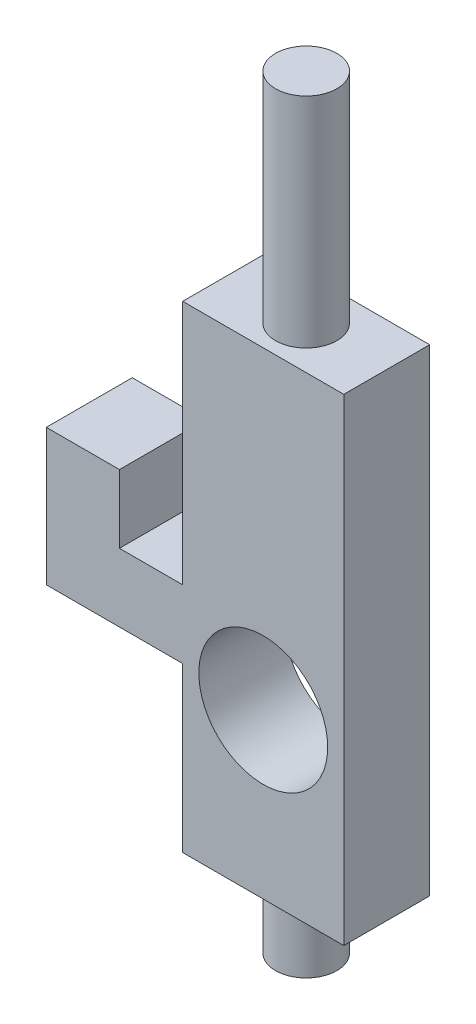
ISO-10303-21;
HEADER;
FILE_DESCRIPTION(('STEP AP214'),'2;1');
FILE_NAME('part.step','',(''),(''),'','','');
FILE_SCHEMA(('AUTOMOTIVE_DESIGN { 1 0 10303 214 1 1 1 1 }'));
ENDSEC;
DATA;
#1=APPLICATION_CONTEXT('core data for automotive mechanical design processes');
#2=APPLICATION_PROTOCOL_DEFINITION('international standard','automotive_design',2000,#1);
#3=PRODUCT_CONTEXT('',#1,'mechanical');
#4=PRODUCT('Part','Part','',(#3));
#5=PRODUCT_RELATED_PRODUCT_CATEGORY('part','',(#4));
#6=PRODUCT_DEFINITION_FORMATION('','',#4);
#7=PRODUCT_DEFINITION_CONTEXT('part definition',#1,'design');
#8=PRODUCT_DEFINITION('design','',#6,#7);
#9=PRODUCT_DEFINITION_SHAPE('','',#8);
#10=(LENGTH_UNIT() NAMED_UNIT(*) SI_UNIT(.MILLI.,.METRE.));
#11=(NAMED_UNIT(*) PLANE_ANGLE_UNIT() SI_UNIT($,.RADIAN.));
#12=(NAMED_UNIT(*) SI_UNIT($,.STERADIAN.) SOLID_ANGLE_UNIT());
#13=UNCERTAINTY_MEASURE_WITH_UNIT(LENGTH_MEASURE(1.E-05),#10,'distance_accuracy_value','');
#14=(GEOMETRIC_REPRESENTATION_CONTEXT(3) GLOBAL_UNCERTAINTY_ASSIGNED_CONTEXT((#13)) GLOBAL_UNIT_ASSIGNED_CONTEXT((#10,
#11,#12)) REPRESENTATION_CONTEXT('',''));
#15=CARTESIAN_POINT('',(0.,0.,0.));
#16=DIRECTION('',(0.,0.,1.));
#17=DIRECTION('',(1.,0.,0.));
#18=AXIS2_PLACEMENT_3D('',#15,#16,#17);
#19=CARTESIAN_POINT('',(-20.2,27.94,-3.99999999999999));
#20=DIRECTION('',(0.,-1.,0.));
#21=DIRECTION('',(0.,0.,-1.));
#22=AXIS2_PLACEMENT_3D('',#19,#20,#21);
#23=PLANE('',#22);
#24=DIRECTION('',(0.,0.,-1.));
#25=VECTOR('',#24,1.);
#26=CARTESIAN_POINT('',(-13.3876706043336,27.94,3.99999999999999));
#27=LINE('',#26,#25);
#28=CARTESIAN_POINT('',(-13.3876706043336,27.94,3.99999999999999));
#29=VERTEX_POINT('',#28);
#30=CARTESIAN_POINT('',(-13.3876706043336,27.94,-3.99999999999999));
#31=VERTEX_POINT('',#30);
#32=EDGE_CURVE('E135',#29,#31,#27,.T.);
#33=ORIENTED_EDGE('',*,*,#32,.F.);
#34=DIRECTION('',(1.,0.,0.));
#35=VECTOR('',#34,1.);
#36=CARTESIAN_POINT('',(-20.2,27.94,4.));
#37=LINE('',#36,#35);
#38=CARTESIAN_POINT('',(-7.5,27.94,4.));
#39=VERTEX_POINT('',#38);
#40=EDGE_CURVE('E158',#29,#39,#37,.T.);
#41=ORIENTED_EDGE('',*,*,#40,.T.);
#42=DIRECTION('',(0.,0.,-1.));
#43=VECTOR('',#42,1.);
#44=CARTESIAN_POINT('',(-7.5,27.94,-4.));
#45=LINE('',#44,#43);
#46=CARTESIAN_POINT('',(-7.5,27.94,-4.));
#47=VERTEX_POINT('',#46);
#48=EDGE_CURVE('E144',#39,#47,#45,.T.);
#49=ORIENTED_EDGE('',*,*,#48,.T.);
#50=DIRECTION('',(1.,0.,0.));
#51=VECTOR('',#50,1.);
#52=CARTESIAN_POINT('',(-20.2,27.94,-3.99999999999999));
#53=LINE('',#52,#51);
#54=EDGE_CURVE('E156',#31,#47,#53,.T.);
#55=ORIENTED_EDGE('',*,*,#54,.F.);
#56=EDGE_LOOP('',(#33,#41,#49,#55));
#57=FACE_BOUND('',#56,.T.);
#58=ADVANCED_FACE('F33',(#57),#23,.F.);
#59=CARTESIAN_POINT('',(-7.5,50.8,-4.));
#60=DIRECTION('',(1.,0.,0.));
#61=DIRECTION('',(0.,0.,-1.));
#62=AXIS2_PLACEMENT_3D('',#59,#60,#61);
#63=PLANE('',#62);
#64=DIRECTION('',(0.,0.,1.));
#65=VECTOR('',#64,1.);
#66=CARTESIAN_POINT('',(-7.5,21.59,-4.));
#67=LINE('',#66,#65);
#68=CARTESIAN_POINT('',(-7.5,21.59,-4.));
#69=VERTEX_POINT('',#68);
#70=CARTESIAN_POINT('',(-7.5,21.59,4.));
#71=VERTEX_POINT('',#70);
#72=EDGE_CURVE('E50',#69,#71,#67,.T.);
#73=ORIENTED_EDGE('',*,*,#72,.F.);
#74=DIRECTION('',(0.,-1.,0.));
#75=VECTOR('',#74,1.);
#76=CARTESIAN_POINT('',(-7.5,50.8,-4.));
#77=LINE('',#76,#75);
#78=CARTESIAN_POINT('',(-7.5,6.35,-4.));
#79=VERTEX_POINT('',#78);
#80=EDGE_CURVE('E194',#69,#79,#77,.T.);
#81=ORIENTED_EDGE('',*,*,#80,.T.);
#82=DIRECTION('',(0.,0.,1.));
#83=VECTOR('',#82,1.);
#84=CARTESIAN_POINT('',(-7.5,6.35,-4.));
#85=LINE('',#84,#83);
#86=CARTESIAN_POINT('',(-7.5,6.35,4.));
#87=VERTEX_POINT('',#86);
#88=EDGE_CURVE('E186',#79,#87,#85,.T.);
#89=ORIENTED_EDGE('',*,*,#88,.T.);
#90=DIRECTION('',(0.,-1.,0.));
#91=VECTOR('',#90,1.);
#92=CARTESIAN_POINT('',(-7.5,50.8,4.));
#93=LINE('',#92,#91);
#94=EDGE_CURVE('E55',#71,#87,#93,.T.);
#95=ORIENTED_EDGE('',*,*,#94,.F.);
#96=EDGE_LOOP('',(#73,#81,#89,#95));
#97=FACE_BOUND('',#96,.T.);
#98=ADVANCED_FACE('F220',(#97),#63,.F.);
#99=ORIENTED_EDGE('',*,*,#48,.F.);
#100=CARTESIAN_POINT('',(-7.5,50.8,4.));
#101=VERTEX_POINT('',#100);
#102=EDGE_CURVE('E191',#101,#39,#93,.T.);
#103=ORIENTED_EDGE('',*,*,#102,.F.);
#104=DIRECTION('',(0.,0.,1.));
#105=VECTOR('',#104,1.);
#106=CARTESIAN_POINT('',(-7.5,50.8,-4.));
#107=LINE('',#106,#105);
#108=CARTESIAN_POINT('',(-7.5,50.8,-4.));
#109=VERTEX_POINT('',#108);
#110=EDGE_CURVE('E176',#109,#101,#107,.T.);
#111=ORIENTED_EDGE('',*,*,#110,.F.);
#112=EDGE_CURVE('E195',#109,#47,#77,.T.);
#113=ORIENTED_EDGE('',*,*,#112,.T.);
#114=EDGE_LOOP('',(#99,#103,#111,#113));
#115=FACE_BOUND('',#114,.T.);
#116=ADVANCED_FACE('F217',(#115),#63,.F.);
#117=CARTESIAN_POINT('',(0.,6.35,0.));
#118=DIRECTION('',(0.,-1.,0.));
#119=DIRECTION('',(0.,0.,-1.));
#120=AXIS2_PLACEMENT_3D('',#117,#118,#119);
#121=CYLINDRICAL_SURFACE('',#120,2.855);
#122=CARTESIAN_POINT('',(0.,6.35,0.));
#123=DIRECTION('',(0.,1.,0.));
#124=DIRECTION('',(0.,0.,1.));
#125=AXIS2_PLACEMENT_3D('',#122,#123,#124);
#126=CIRCLE('',#125,2.855);
#127=CARTESIAN_POINT('',(0.,6.35,2.855));
#128=VERTEX_POINT('',#127);
#129=EDGE_CURVE('E42',#128,#128,#126,.T.);
#130=ORIENTED_EDGE('',*,*,#129,.F.);
#131=EDGE_LOOP('',(#130));
#132=FACE_BOUND('',#131,.T.);
#133=CARTESIAN_POINT('',(0.,0.,0.));
#134=DIRECTION('',(0.,1.,0.));
#135=DIRECTION('',(0.,0.,1.));
#136=AXIS2_PLACEMENT_3D('',#133,#134,#135);
#137=CIRCLE('',#136,2.855);
#138=CARTESIAN_POINT('',(0.,0.,2.855));
#139=VERTEX_POINT('',#138);
#140=EDGE_CURVE('E37',#139,#139,#137,.T.);
#141=ORIENTED_EDGE('',*,*,#140,.T.);
#142=EDGE_LOOP('',(#141));
#143=FACE_BOUND('',#142,.T.);
#144=ADVANCED_FACE('F35',(#132,#143),#121,.T.);
#145=CARTESIAN_POINT('',(0.,0.,0.));
#146=DIRECTION('',(0.,1.,0.));
#147=DIRECTION('',(0.,0.,1.));
#148=AXIS2_PLACEMENT_3D('',#145,#146,#147);
#149=PLANE('',#148);
#150=ORIENTED_EDGE('',*,*,#140,.F.);
#151=EDGE_LOOP('',(#150));
#152=FACE_BOUND('',#151,.T.);
#153=ADVANCED_FACE('F207',(#152),#149,.F.);
#154=CARTESIAN_POINT('',(7.5,50.8,-4.));
#155=DIRECTION('',(-1.,0.,0.));
#156=DIRECTION('',(0.,0.,1.));
#157=AXIS2_PLACEMENT_3D('',#154,#155,#156);
#158=PLANE('',#157);
#159=DIRECTION('',(0.,0.,-1.));
#160=VECTOR('',#159,1.);
#161=CARTESIAN_POINT('',(7.5,6.35,-4.));
#162=LINE('',#161,#160);
#163=CARTESIAN_POINT('',(7.5,6.35,4.));
#164=VERTEX_POINT('',#163);
#165=CARTESIAN_POINT('',(7.5,6.35,-4.));
#166=VERTEX_POINT('',#165);
#167=EDGE_CURVE('E169',#164,#166,#162,.T.);
#168=ORIENTED_EDGE('',*,*,#167,.T.);
#169=DIRECTION('',(0.,-1.,0.));
#170=VECTOR('',#169,1.);
#171=CARTESIAN_POINT('',(7.5,50.8,-4.));
#172=LINE('',#171,#170);
#173=CARTESIAN_POINT('',(7.5,50.8,-4.));
#174=VERTEX_POINT('',#173);
#175=EDGE_CURVE('E198',#174,#166,#172,.T.);
#176=ORIENTED_EDGE('',*,*,#175,.F.);
#177=DIRECTION('',(0.,0.,-1.));
#178=VECTOR('',#177,1.);
#179=CARTESIAN_POINT('',(7.5,50.8,-4.));
#180=LINE('',#179,#178);
#181=CARTESIAN_POINT('',(7.5,50.8,4.));
#182=VERTEX_POINT('',#181);
#183=EDGE_CURVE('E170',#182,#174,#180,.T.);
#184=ORIENTED_EDGE('',*,*,#183,.F.);
#185=DIRECTION('',(0.,-1.,0.));
#186=VECTOR('',#185,1.);
#187=CARTESIAN_POINT('',(7.5,50.8,4.));
#188=LINE('',#187,#186);
#189=EDGE_CURVE('E180',#182,#164,#188,.T.);
#190=ORIENTED_EDGE('',*,*,#189,.T.);
#191=EDGE_LOOP('',(#168,#176,#184,#190));
#192=FACE_BOUND('',#191,.T.);
#193=ADVANCED_FACE('F209',(#192),#158,.F.);
#194=CARTESIAN_POINT('',(-7.5,50.8,-4.));
#195=DIRECTION('',(0.,0.,1.));
#196=DIRECTION('',(1.,0.,0.));
#197=AXIS2_PLACEMENT_3D('',#194,#195,#196);
#198=PLANE('',#197);
#199=CARTESIAN_POINT('',(0.,21.59,-4.));
#200=DIRECTION('',(0.,0.,1.));
#201=DIRECTION('',(1.,0.,0.));
#202=AXIS2_PLACEMENT_3D('',#199,#200,#201);
#203=CIRCLE('',#202,6.);
#204=CARTESIAN_POINT('',(6.,21.59,-4.));
#205=VERTEX_POINT('',#204);
#206=EDGE_CURVE('E166',#205,#205,#203,.T.);
#207=ORIENTED_EDGE('',*,*,#206,.T.);
#208=EDGE_LOOP('',(#207));
#209=FACE_BOUND('',#208,.T.);
#210=DIRECTION('',(-1.,0.,0.));
#211=VECTOR('',#210,1.);
#212=CARTESIAN_POINT('',(-7.5,6.35,-4.));
#213=LINE('',#212,#211);
#214=EDGE_CURVE('E183',#166,#79,#213,.T.);
#215=ORIENTED_EDGE('',*,*,#214,.T.);
#216=ORIENTED_EDGE('',*,*,#80,.F.);
#217=DIRECTION('',(1.,0.,0.));
#218=VECTOR('',#217,1.);
#219=CARTESIAN_POINT('',(-20.2,21.59,-3.99999999999999));
#220=LINE('',#219,#218);
#221=CARTESIAN_POINT('',(-20.2,21.59,-3.99999999999999));
#222=VERTEX_POINT('',#221);
#223=EDGE_CURVE('E153',#222,#69,#220,.T.);
#224=ORIENTED_EDGE('',*,*,#223,.F.);
#225=DIRECTION('',(0.,-1.,0.));
#226=VECTOR('',#225,1.);
#227=CARTESIAN_POINT('',(-20.2,21.59,-3.99999999999999));
#228=LINE('',#227,#226);
#229=CARTESIAN_POINT('',(-20.2,34.29,-3.99999999999999));
#230=VERTEX_POINT('',#229);
#231=EDGE_CURVE('E120',#230,#222,#228,.T.);
#232=ORIENTED_EDGE('',*,*,#231,.F.);
#233=DIRECTION('',(-1.,0.,0.));
#234=VECTOR('',#233,1.);
#235=CARTESIAN_POINT('',(-13.3876706043336,34.29,-3.99999999999999));
#236=LINE('',#235,#234);
#237=CARTESIAN_POINT('',(-13.3876706043336,34.29,-3.99999999999999));
#238=VERTEX_POINT('',#237);
#239=EDGE_CURVE('E134',#238,#230,#236,.T.);
#240=ORIENTED_EDGE('',*,*,#239,.F.);
#241=DIRECTION('',(0.,-1.,0.));
#242=VECTOR('',#241,1.);
#243=CARTESIAN_POINT('',(-13.3876706043336,34.29,-3.99999999999999));
#244=LINE('',#243,#242);
#245=EDGE_CURVE('E140',#238,#31,#244,.T.);
#246=ORIENTED_EDGE('',*,*,#245,.T.);
#247=ORIENTED_EDGE('',*,*,#54,.T.);
#248=ORIENTED_EDGE('',*,*,#112,.F.);
#249=DIRECTION('',(-1.,0.,0.));
#250=VECTOR('',#249,1.);
#251=CARTESIAN_POINT('',(-7.5,50.8,-4.));
#252=LINE('',#251,#250);
#253=EDGE_CURVE('E173',#174,#109,#252,.T.);
#254=ORIENTED_EDGE('',*,*,#253,.F.);
#255=ORIENTED_EDGE('',*,*,#175,.T.);
#256=EDGE_LOOP('',(#215,#216,#224,#232,#240,#246,#247,#248,#254,#255));
#257=FACE_BOUND('',#256,.T.);
#258=ADVANCED_FACE('F214',(#209,#257),#198,.F.);
#259=CARTESIAN_POINT('',(-7.5,50.8,4.));
#260=DIRECTION('',(0.,0.,-1.));
#261=DIRECTION('',(-1.,0.,0.));
#262=AXIS2_PLACEMENT_3D('',#259,#260,#261);
#263=PLANE('',#262);
#264=CARTESIAN_POINT('',(0.,21.59,4.));
#265=DIRECTION('',(0.,0.,1.));
#266=DIRECTION('',(1.,0.,0.));
#267=AXIS2_PLACEMENT_3D('',#264,#265,#266);
#268=CIRCLE('',#267,6.);
#269=CARTESIAN_POINT('',(6.,21.59,4.));
#270=VERTEX_POINT('',#269);
#271=EDGE_CURVE('E162',#270,#270,#268,.T.);
#272=ORIENTED_EDGE('',*,*,#271,.F.);
#273=EDGE_LOOP('',(#272));
#274=FACE_BOUND('',#273,.T.);
#275=DIRECTION('',(1.,0.,0.));
#276=VECTOR('',#275,1.);
#277=CARTESIAN_POINT('',(-7.5,6.35,4.));
#278=LINE('',#277,#276);
#279=EDGE_CURVE('E174',#87,#164,#278,.T.);
#280=ORIENTED_EDGE('',*,*,#279,.T.);
#281=ORIENTED_EDGE('',*,*,#189,.F.);
#282=DIRECTION('',(1.,0.,0.));
#283=VECTOR('',#282,1.);
#284=CARTESIAN_POINT('',(-7.5,50.8,4.));
#285=LINE('',#284,#283);
#286=EDGE_CURVE('E178',#101,#182,#285,.T.);
#287=ORIENTED_EDGE('',*,*,#286,.F.);
#288=ORIENTED_EDGE('',*,*,#102,.T.);
#289=ORIENTED_EDGE('',*,*,#40,.F.);
#290=DIRECTION('',(0.,-1.,0.));
#291=VECTOR('',#290,1.);
#292=CARTESIAN_POINT('',(-13.3876706043336,34.29,3.99999999999999));
#293=LINE('',#292,#291);
#294=CARTESIAN_POINT('',(-13.3876706043336,34.29,3.99999999999999));
#295=VERTEX_POINT('',#294);
#296=EDGE_CURVE('E126',#295,#29,#293,.T.);
#297=ORIENTED_EDGE('',*,*,#296,.F.);
#298=DIRECTION('',(1.,0.,0.));
#299=VECTOR('',#298,1.);
#300=CARTESIAN_POINT('',(-13.3876706043336,34.29,3.99999999999999));
#301=LINE('',#300,#299);
#302=CARTESIAN_POINT('',(-20.2,34.29,3.99999999999999));
#303=VERTEX_POINT('',#302);
#304=EDGE_CURVE('E123',#303,#295,#301,.T.);
#305=ORIENTED_EDGE('',*,*,#304,.F.);
#306=DIRECTION('',(0.,1.,0.));
#307=VECTOR('',#306,1.);
#308=CARTESIAN_POINT('',(-20.2,21.59,4.));
#309=LINE('',#308,#307);
#310=CARTESIAN_POINT('',(-20.2,21.59,4.));
#311=VERTEX_POINT('',#310);
#312=EDGE_CURVE('E110',#311,#303,#309,.T.);
#313=ORIENTED_EDGE('',*,*,#312,.F.);
#314=DIRECTION('',(1.,0.,0.));
#315=VECTOR('',#314,1.);
#316=CARTESIAN_POINT('',(-20.2,21.59,4.));
#317=LINE('',#316,#315);
#318=EDGE_CURVE('E148',#311,#71,#317,.T.);
#319=ORIENTED_EDGE('',*,*,#318,.T.);
#320=ORIENTED_EDGE('',*,*,#94,.T.);
#321=EDGE_LOOP('',(#280,#281,#287,#288,#289,#297,#305,#313,#319,#320));
#322=FACE_BOUND('',#321,.T.);
#323=ADVANCED_FACE('F124',(#274,#322),#263,.F.);
#324=CARTESIAN_POINT('',(0.,50.8,0.));
#325=DIRECTION('',(0.,1.,0.));
#326=DIRECTION('',(0.,0.,1.));
#327=AXIS2_PLACEMENT_3D('',#324,#325,#326);
#328=PLANE('',#327);
#329=CARTESIAN_POINT('',(0.,50.8,0.));
#330=DIRECTION('',(0.,1.,0.));
#331=DIRECTION('',(0.,0.,1.));
#332=AXIS2_PLACEMENT_3D('',#329,#330,#331);
#333=CIRCLE('',#332,2.855);
#334=CARTESIAN_POINT('',(0.,50.8,2.855));
#335=VERTEX_POINT('',#334);
#336=EDGE_CURVE('E11',#335,#335,#333,.T.);
#337=ORIENTED_EDGE('',*,*,#336,.F.);
#338=EDGE_LOOP('',(#337));
#339=FACE_BOUND('',#338,.T.);
#340=ORIENTED_EDGE('',*,*,#183,.T.);
#341=ORIENTED_EDGE('',*,*,#253,.T.);
#342=ORIENTED_EDGE('',*,*,#110,.T.);
#343=ORIENTED_EDGE('',*,*,#286,.T.);
#344=EDGE_LOOP('',(#340,#341,#342,#343));
#345=FACE_BOUND('',#344,.T.);
#346=ADVANCED_FACE('F245',(#339,#345),#328,.T.);
#347=CARTESIAN_POINT('',(0.,6.35,0.));
#348=DIRECTION('',(0.,1.,0.));
#349=DIRECTION('',(0.,0.,1.));
#350=AXIS2_PLACEMENT_3D('',#347,#348,#349);
#351=PLANE('',#350);
#352=ORIENTED_EDGE('',*,*,#129,.T.);
#353=EDGE_LOOP('',(#352));
#354=FACE_BOUND('',#353,.T.);
#355=ORIENTED_EDGE('',*,*,#167,.F.);
#356=ORIENTED_EDGE('',*,*,#279,.F.);
#357=ORIENTED_EDGE('',*,*,#88,.F.);
#358=ORIENTED_EDGE('',*,*,#214,.F.);
#359=EDGE_LOOP('',(#355,#356,#357,#358));
#360=FACE_BOUND('',#359,.T.);
#361=ADVANCED_FACE('F243',(#354,#360),#351,.F.);
#362=CARTESIAN_POINT('',(0.,21.59,-21.4));
#363=DIRECTION('',(0.,0.,1.));
#364=DIRECTION('',(1.,0.,0.));
#365=AXIS2_PLACEMENT_3D('',#362,#363,#364);
#366=CYLINDRICAL_SURFACE('',#365,6.);
#367=ORIENTED_EDGE('',*,*,#271,.T.);
#368=EDGE_LOOP('',(#367));
#369=FACE_BOUND('',#368,.T.);
#370=ORIENTED_EDGE('',*,*,#206,.F.);
#371=EDGE_LOOP('',(#370));
#372=FACE_BOUND('',#371,.T.);
#373=ADVANCED_FACE('F239',(#369,#372),#366,.F.);
#374=CARTESIAN_POINT('',(0.,71.12,0.));
#375=DIRECTION('',(0.,-1.,0.));
#376=DIRECTION('',(0.,0.,-1.));
#377=AXIS2_PLACEMENT_3D('',#374,#375,#376);
#378=CYLINDRICAL_SURFACE('',#377,2.855);
#379=CARTESIAN_POINT('',(0.,71.12,0.));
#380=DIRECTION('',(0.,1.,0.));
#381=DIRECTION('',(0.,0.,1.));
#382=AXIS2_PLACEMENT_3D('',#379,#380,#381);
#383=CIRCLE('',#382,2.855);
#384=CARTESIAN_POINT('',(0.,71.12,2.855));
#385=VERTEX_POINT('',#384);
#386=EDGE_CURVE('E160',#385,#385,#383,.T.);
#387=ORIENTED_EDGE('',*,*,#386,.F.);
#388=EDGE_LOOP('',(#387));
#389=FACE_BOUND('',#388,.T.);
#390=ORIENTED_EDGE('',*,*,#336,.T.);
#391=EDGE_LOOP('',(#390));
#392=FACE_BOUND('',#391,.T.);
#393=ADVANCED_FACE('F235',(#389,#392),#378,.T.);
#394=CARTESIAN_POINT('',(0.,71.12,0.));
#395=DIRECTION('',(0.,1.,0.));
#396=DIRECTION('',(0.,0.,1.));
#397=AXIS2_PLACEMENT_3D('',#394,#395,#396);
#398=PLANE('',#397);
#399=ORIENTED_EDGE('',*,*,#386,.T.);
#400=EDGE_LOOP('',(#399));
#401=FACE_BOUND('',#400,.T.);
#402=ADVANCED_FACE('F232',(#401),#398,.T.);
#403=CARTESIAN_POINT('',(-20.2,21.59,-3.99999999999999));
#404=DIRECTION('',(0.,1.,0.));
#405=DIRECTION('',(0.,0.,1.));
#406=AXIS2_PLACEMENT_3D('',#403,#404,#405);
#407=PLANE('',#406);
#408=ORIENTED_EDGE('',*,*,#72,.T.);
#409=ORIENTED_EDGE('',*,*,#318,.F.);
#410=DIRECTION('',(0.,0.,1.));
#411=VECTOR('',#410,1.);
#412=CARTESIAN_POINT('',(-20.2,21.59,-3.99999999999999));
#413=LINE('',#412,#411);
#414=EDGE_CURVE('E116',#222,#311,#413,.T.);
#415=ORIENTED_EDGE('',*,*,#414,.F.);
#416=ORIENTED_EDGE('',*,*,#223,.T.);
#417=EDGE_LOOP('',(#408,#409,#415,#416));
#418=FACE_BOUND('',#417,.T.);
#419=ADVANCED_FACE('F230',(#418),#407,.F.);
#420=CARTESIAN_POINT('',(-20.2,0.,0.));
#421=DIRECTION('',(1.,0.,0.));
#422=DIRECTION('',(0.,0.,-1.));
#423=AXIS2_PLACEMENT_3D('',#420,#421,#422);
#424=PLANE('',#423);
#425=ORIENTED_EDGE('',*,*,#312,.T.);
#426=DIRECTION('',(0.,0.,1.));
#427=VECTOR('',#426,1.);
#428=CARTESIAN_POINT('',(-20.2,34.29,3.99999999999999));
#429=LINE('',#428,#427);
#430=EDGE_CURVE('E114',#230,#303,#429,.T.);
#431=ORIENTED_EDGE('',*,*,#430,.F.);
#432=ORIENTED_EDGE('',*,*,#231,.T.);
#433=ORIENTED_EDGE('',*,*,#414,.T.);
#434=EDGE_LOOP('',(#425,#431,#432,#433));
#435=FACE_BOUND('',#434,.T.);
#436=ADVANCED_FACE('F112',(#435),#424,.F.);
#437=CARTESIAN_POINT('',(-13.3876706043336,34.29,3.99999999999999));
#438=DIRECTION('',(-1.,0.,0.));
#439=DIRECTION('',(0.,0.,1.));
#440=AXIS2_PLACEMENT_3D('',#437,#438,#439);
#441=PLANE('',#440);
#442=ORIENTED_EDGE('',*,*,#32,.T.);
#443=ORIENTED_EDGE('',*,*,#245,.F.);
#444=DIRECTION('',(0.,0.,-1.));
#445=VECTOR('',#444,1.);
#446=CARTESIAN_POINT('',(-13.3876706043336,34.29,3.99999999999999));
#447=LINE('',#446,#445);
#448=EDGE_CURVE('E129',#295,#238,#447,.T.);
#449=ORIENTED_EDGE('',*,*,#448,.F.);
#450=ORIENTED_EDGE('',*,*,#296,.T.);
#451=EDGE_LOOP('',(#442,#443,#449,#450));
#452=FACE_BOUND('',#451,.T.);
#453=ADVANCED_FACE('F278',(#452),#441,.F.);
#454=CARTESIAN_POINT('',(0.,34.29,0.));
#455=DIRECTION('',(0.,1.,0.));
#456=DIRECTION('',(0.,0.,1.));
#457=AXIS2_PLACEMENT_3D('',#454,#455,#456);
#458=PLANE('',#457);
#459=ORIENTED_EDGE('',*,*,#430,.T.);
#460=ORIENTED_EDGE('',*,*,#304,.T.);
#461=ORIENTED_EDGE('',*,*,#448,.T.);
#462=ORIENTED_EDGE('',*,*,#239,.T.);
#463=EDGE_LOOP('',(#459,#460,#461,#462));
#464=FACE_BOUND('',#463,.T.);
#465=ADVANCED_FACE('F132',(#464),#458,.T.);
#466=CLOSED_SHELL('',(#58,#98,#116,#144,#153,#193,#258,#323,#346,#361,#373,#393,#402,#419,#436,
#453,#465));
#467=MANIFOLD_SOLID_BREP('B2',#466);
#468=ADVANCED_BREP_SHAPE_REPRESENTATION('',(#18,#467),#14);
#469=SHAPE_DEFINITION_REPRESENTATION(#9,#468);
ENDSEC;
END-ISO-10303-21;
